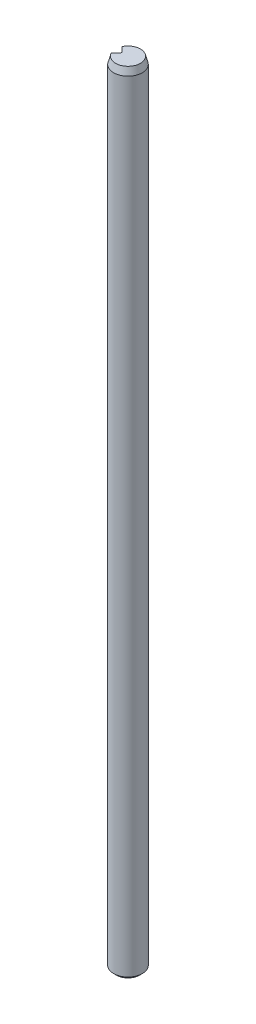
ISO-10303-21;
HEADER;
FILE_DESCRIPTION(('STEP AP214'),'2;1');
FILE_NAME('part.step','',(''),(''),'','','');
FILE_SCHEMA(('AUTOMOTIVE_DESIGN { 1 0 10303 214 1 1 1 1 }'));
ENDSEC;
DATA;
#1=APPLICATION_CONTEXT('core data for automotive mechanical design processes');
#2=APPLICATION_PROTOCOL_DEFINITION('international standard','automotive_design',2000,#1);
#3=PRODUCT_CONTEXT('',#1,'mechanical');
#4=PRODUCT('Part','Part','',(#3));
#5=PRODUCT_RELATED_PRODUCT_CATEGORY('part','',(#4));
#6=PRODUCT_DEFINITION_FORMATION('','',#4);
#7=PRODUCT_DEFINITION_CONTEXT('part definition',#1,'design');
#8=PRODUCT_DEFINITION('design','',#6,#7);
#9=PRODUCT_DEFINITION_SHAPE('','',#8);
#10=(LENGTH_UNIT() NAMED_UNIT(*) SI_UNIT(.MILLI.,.METRE.));
#11=(NAMED_UNIT(*) PLANE_ANGLE_UNIT() SI_UNIT($,.RADIAN.));
#12=(NAMED_UNIT(*) SI_UNIT($,.STERADIAN.) SOLID_ANGLE_UNIT());
#13=UNCERTAINTY_MEASURE_WITH_UNIT(LENGTH_MEASURE(1.E-05),#10,'distance_accuracy_value','');
#14=(GEOMETRIC_REPRESENTATION_CONTEXT(3) GLOBAL_UNCERTAINTY_ASSIGNED_CONTEXT((#13)) GLOBAL_UNIT_ASSIGNED_CONTEXT((#10,
#11,#12)) REPRESENTATION_CONTEXT('',''));
#15=CARTESIAN_POINT('',(0.,0.,0.));
#16=DIRECTION('',(0.,0.,1.));
#17=DIRECTION('',(1.,0.,0.));
#18=AXIS2_PLACEMENT_3D('',#15,#16,#17);
#19=CARTESIAN_POINT('',(0.,55.,0.));
#20=DIRECTION('',(0.,-1.,0.));
#21=DIRECTION('',(0.,0.,-1.));
#22=AXIS2_PLACEMENT_3D('',#19,#20,#21);
#23=CYLINDRICAL_SURFACE('',#22,1.);
#24=DIRECTION('',(0.,1.,0.));
#25=VECTOR('',#24,1.);
#26=CARTESIAN_POINT('',(-0.878280892974548,0.,0.478145033473976));
#27=LINE('',#26,#25);
#28=CARTESIAN_POINT('',(-0.878280892974548,0.199999999999992,0.478145033473976));
#29=VERTEX_POINT('',#28);
#30=CARTESIAN_POINT('',(-0.878280892974548,54.5,0.478145033473976));
#31=VERTEX_POINT('',#30);
#32=EDGE_CURVE('E122',#29,#31,#27,.T.);
#33=ORIENTED_EDGE('',*,*,#32,.F.);
#34=CARTESIAN_POINT('',(0.,0.199999999999992,0.));
#35=DIRECTION('',(0.,1.,0.));
#36=DIRECTION('',(0.,0.,1.));
#37=AXIS2_PLACEMENT_3D('',#34,#35,#36);
#38=CIRCLE('',#37,1.);
#39=CARTESIAN_POINT('',(-0.878280892974548,0.199999999999992,-0.478145033473976));
#40=VERTEX_POINT('',#39);
#41=EDGE_CURVE('E150',#29,#40,#38,.T.);
#42=ORIENTED_EDGE('',*,*,#41,.T.);
#43=DIRECTION('',(0.,1.,0.));
#44=VECTOR('',#43,1.);
#45=CARTESIAN_POINT('',(-0.878280892974548,0.,-0.478145033473976));
#46=LINE('',#45,#44);
#47=CARTESIAN_POINT('',(-0.878280892974548,54.5,-0.478145033473976));
#48=VERTEX_POINT('',#47);
#49=EDGE_CURVE('E108',#40,#48,#46,.T.);
#50=ORIENTED_EDGE('',*,*,#49,.T.);
#51=CARTESIAN_POINT('',(0.,54.5,0.));
#52=DIRECTION('',(0.,1.,0.));
#53=DIRECTION('',(0.,0.,1.));
#54=AXIS2_PLACEMENT_3D('',#51,#52,#53);
#55=CIRCLE('',#54,1.);
#56=EDGE_CURVE('E133',#48,#31,#55,.F.);
#57=ORIENTED_EDGE('',*,*,#56,.T.);
#58=EDGE_LOOP('',(#33,#42,#50,#57));
#59=FACE_BOUND('',#58,.T.);
#60=ADVANCED_FACE('F33',(#59),#23,.T.);
#61=CARTESIAN_POINT('',(0.,55.,0.));
#62=DIRECTION('',(0.,1.,0.));
#63=DIRECTION('',(0.,0.,1.));
#64=AXIS2_PLACEMENT_3D('',#61,#62,#63);
#65=PLANE('',#64);
#66=DIRECTION('',(0.707106781186548,0.,-0.707106781186547));
#67=VECTOR('',#66,1.);
#68=CARTESIAN_POINT('',(-0.400135859500572,55.,0.));
#69=LINE('',#68,#67);
#70=CARTESIAN_POINT('',(-0.778836297480789,55.,0.378700437980217));
#71=VERTEX_POINT('',#70);
#72=CARTESIAN_POINT('',(-0.470846537619226,55.,0.0707106781186547));
#73=VERTEX_POINT('',#72);
#74=EDGE_CURVE('E115',#71,#73,#69,.T.);
#75=ORIENTED_EDGE('',*,*,#74,.F.);
#76=CARTESIAN_POINT('',(0.,55.,0.));
#77=DIRECTION('',(0.,1.,0.));
#78=DIRECTION('',(0.,0.,1.));
#79=AXIS2_PLACEMENT_3D('',#76,#77,#78);
#80=CIRCLE('',#79,0.866025403784434);
#81=CARTESIAN_POINT('',(-0.778836297480789,55.,-0.378700437980217));
#82=VERTEX_POINT('',#81);
#83=EDGE_CURVE('E113',#71,#82,#80,.T.);
#84=ORIENTED_EDGE('',*,*,#83,.T.);
#85=DIRECTION('',(-0.707106781186548,0.,-0.707106781186547));
#86=VECTOR('',#85,1.);
#87=CARTESIAN_POINT('',(-0.878280892974548,55.,-0.478145033473976));
#88=LINE('',#87,#86);
#89=CARTESIAN_POINT('',(-0.470846537619226,55.,-0.0707106781186547));
#90=VERTEX_POINT('',#89);
#91=EDGE_CURVE('E106',#90,#82,#88,.T.);
#92=ORIENTED_EDGE('',*,*,#91,.F.);
#93=CARTESIAN_POINT('',(-0.541557215737881,55.,0.));
#94=DIRECTION('',(0.,1.,0.));
#95=DIRECTION('',(0.,0.,1.));
#96=AXIS2_PLACEMENT_3D('',#93,#94,#95);
#97=CIRCLE('',#96,0.1);
#98=EDGE_CURVE('E91',#90,#73,#97,.F.);
#99=ORIENTED_EDGE('',*,*,#98,.T.);
#100=EDGE_LOOP('',(#75,#84,#92,#99));
#101=FACE_BOUND('',#100,.T.);
#102=ADVANCED_FACE('F111',(#101),#65,.T.);
#103=CARTESIAN_POINT('',(0.,0.,0.));
#104=DIRECTION('',(0.,1.,0.));
#105=DIRECTION('',(0.,0.,1.));
#106=AXIS2_PLACEMENT_3D('',#103,#104,#105);
#107=PLANE('',#106);
#108=DIRECTION('',(-0.707106781186548,0.,-0.707106781186547));
#109=VECTOR('',#108,1.);
#110=CARTESIAN_POINT('',(-0.878280892974548,0.,-0.478145033473976));
#111=LINE('',#110,#109);
#112=CARTESIAN_POINT('',(-0.470846537619226,0.,-0.0707106781186547));
#113=VERTEX_POINT('',#112);
#114=CARTESIAN_POINT('',(-0.729192511947562,0.,-0.32905665244699));
#115=VERTEX_POINT('',#114);
#116=EDGE_CURVE('E107',#113,#115,#111,.T.);
#117=ORIENTED_EDGE('',*,*,#116,.T.);
#118=CARTESIAN_POINT('',(0.,0.,0.));
#119=DIRECTION('',(0.,1.,0.));
#120=DIRECTION('',(0.,0.,1.));
#121=AXIS2_PLACEMENT_3D('',#118,#119,#120);
#122=CIRCLE('',#121,0.800000000000009);
#123=CARTESIAN_POINT('',(-0.729192511947562,0.,0.32905665244699));
#124=VERTEX_POINT('',#123);
#125=EDGE_CURVE('E46',#115,#124,#122,.F.);
#126=ORIENTED_EDGE('',*,*,#125,.T.);
#127=DIRECTION('',(0.707106781186548,0.,-0.707106781186547));
#128=VECTOR('',#127,1.);
#129=CARTESIAN_POINT('',(-0.400135859500572,0.,0.));
#130=LINE('',#129,#128);
#131=CARTESIAN_POINT('',(-0.470846537619226,0.,0.0707106781186547));
#132=VERTEX_POINT('',#131);
#133=EDGE_CURVE('E114',#124,#132,#130,.T.);
#134=ORIENTED_EDGE('',*,*,#133,.T.);
#135=CARTESIAN_POINT('',(-0.541557215737881,0.,0.));
#136=DIRECTION('',(0.,1.,0.));
#137=DIRECTION('',(0.,0.,1.));
#138=AXIS2_PLACEMENT_3D('',#135,#136,#137);
#139=CIRCLE('',#138,0.1);
#140=EDGE_CURVE('E101',#132,#113,#139,.T.);
#141=ORIENTED_EDGE('',*,*,#140,.T.);
#142=EDGE_LOOP('',(#117,#126,#134,#141));
#143=FACE_BOUND('',#142,.T.);
#144=ADVANCED_FACE('F141',(#143),#107,.F.);
#145=CARTESIAN_POINT('',(-0.878280892974548,0.,-0.478145033473976));
#146=DIRECTION('',(0.707106781186547,0.,-0.707106781186548));
#147=DIRECTION('',(-0.707106781186548,0.,-0.707106781186547));
#148=AXIS2_PLACEMENT_3D('',#145,#146,#147);
#149=PLANE('',#148);
#150=ORIENTED_EDGE('',*,*,#49,.F.);
#151=CARTESIAN_POINT('',(-0.878280892974548,0.199999999999992,-0.478145033473976));
#152=CARTESIAN_POINT('',(-0.853560720112385,0.166476995824775,-0.453424860611813));
#153=CARTESIAN_POINT('',(-0.828794369266961,0.133021421270187,-0.428658509766389));
#154=CARTESIAN_POINT('',(-0.791535665449019,0.0830009543926953,-0.391399805948447));
#155=CARTESIAN_POINT('',(-0.779097907516318,0.0663546228998887,-0.378962048015746));
#156=CARTESIAN_POINT('',(-0.754179221522723,0.0331263818504096,-0.354043362022151));
#157=CARTESIAN_POINT('',(-0.741698293048183,0.0165444729142652,-0.341562433547611));
#158=CARTESIAN_POINT('',(-0.729192511947562,0.,-0.32905665244699));
#159=B_SPLINE_CURVE_WITH_KNOTS('',3,(#151,#152,#153,#154,#155,#156,#157,#158),.UNSPECIFIED.,.F.,
.F.,(4,2,2,4),(0.,0.145305985315924,0.217958905103016,0.290612522968146),.UNSPECIFIED.);
#160=EDGE_CURVE('E60',#40,#115,#159,.T.);
#161=ORIENTED_EDGE('',*,*,#160,.T.);
#162=ORIENTED_EDGE('',*,*,#116,.F.);
#163=DIRECTION('',(0.,1.,0.));
#164=VECTOR('',#163,1.);
#165=CARTESIAN_POINT('',(-0.470846537619227,55.,-0.0707106781186547));
#166=LINE('',#165,#164);
#167=EDGE_CURVE('E95',#113,#90,#166,.T.);
#168=ORIENTED_EDGE('',*,*,#167,.T.);
#169=ORIENTED_EDGE('',*,*,#91,.T.);
#170=CARTESIAN_POINT('',(-0.778836297480789,55.,-0.378700437980217));
#171=CARTESIAN_POINT('',(-0.795522766451599,54.9167113590415,-0.395386906951027));
#172=CARTESIAN_POINT('',(-0.812153051098877,54.8334003691738,-0.412017191598305));
#173=CARTESIAN_POINT('',(-0.845301249582123,54.6667337025012,-0.445165390081551));
#174=CARTESIAN_POINT('',(-0.861819163432766,54.5833780257023,-0.461683303932194));
#175=CARTESIAN_POINT('',(-0.878280892974549,54.5,-0.478145033473976));
#176=B_SPLINE_CURVE_WITH_KNOTS('',3,(#170,#171,#172,#173,#174,#175),.UNSPECIFIED.,.F.,.F.,(4,2,
4),(0.,0.259701143449214,0.519402252986724),.UNSPECIFIED.);
#177=EDGE_CURVE('E127',#82,#48,#176,.T.);
#178=ORIENTED_EDGE('',*,*,#177,.T.);
#179=EDGE_LOOP('',(#150,#161,#162,#168,#169,#178));
#180=FACE_BOUND('',#179,.T.);
#181=ADVANCED_FACE('F104',(#180),#149,.F.);
#182=CARTESIAN_POINT('',(-0.400135859500572,0.,0.));
#183=DIRECTION('',(0.707106781186547,0.,0.707106781186548));
#184=DIRECTION('',(0.707106781186548,0.,-0.707106781186547));
#185=AXIS2_PLACEMENT_3D('',#182,#183,#184);
#186=PLANE('',#185);
#187=ORIENTED_EDGE('',*,*,#133,.F.);
#188=CARTESIAN_POINT('',(-0.729192511947562,0.,0.32905665244699));
#189=CARTESIAN_POINT('',(-0.741698293048182,0.0165444729142653,0.341562433547611));
#190=CARTESIAN_POINT('',(-0.754179221522723,0.0331263818504096,0.354043362022152));
#191=CARTESIAN_POINT('',(-0.779097907516318,0.0663546228998887,0.378962048015746));
#192=CARTESIAN_POINT('',(-0.791535665449019,0.0830009543926953,0.391399805948447));
#193=CARTESIAN_POINT('',(-0.828794369266961,0.133021421270187,0.42865850976639));
#194=CARTESIAN_POINT('',(-0.853560720112385,0.166476995824775,0.453424860611813));
#195=CARTESIAN_POINT('',(-0.878280892974548,0.199999999999992,0.478145033473976));
#196=B_SPLINE_CURVE_WITH_KNOTS('',3,(#188,#189,#190,#191,#192,#193,#194,#195),.UNSPECIFIED.,.F.,
.F.,(4,2,2,4),(0.,0.0726536178651295,0.145306537652222,0.290612522968146),.UNSPECIFIED.);
#197=EDGE_CURVE('E11',#124,#29,#196,.T.);
#198=ORIENTED_EDGE('',*,*,#197,.T.);
#199=ORIENTED_EDGE('',*,*,#32,.T.);
#200=CARTESIAN_POINT('',(-0.878280892974548,54.5,0.478145033473976));
#201=CARTESIAN_POINT('',(-0.861819163432765,54.5833780257023,0.461683303932193));
#202=CARTESIAN_POINT('',(-0.845301249582122,54.6667337025012,0.445165390081551));
#203=CARTESIAN_POINT('',(-0.812153051098875,54.8334003691738,0.412017191598304));
#204=CARTESIAN_POINT('',(-0.795522766451598,54.9167113590415,0.395386906951026));
#205=CARTESIAN_POINT('',(-0.778836297480788,55.,0.378700437980216));
#206=B_SPLINE_CURVE_WITH_KNOTS('',3,(#200,#201,#202,#203,#204,#205),.UNSPECIFIED.,.F.,.F.,(4,2,
4),(0.,0.259701109537517,0.519402252986731),.UNSPECIFIED.);
#207=EDGE_CURVE('E152',#31,#71,#206,.T.);
#208=ORIENTED_EDGE('',*,*,#207,.T.);
#209=ORIENTED_EDGE('',*,*,#74,.T.);
#210=DIRECTION('',(0.,1.,0.));
#211=VECTOR('',#210,1.);
#212=CARTESIAN_POINT('',(-0.470846537619226,0.,0.0707106781186548));
#213=LINE('',#212,#211);
#214=EDGE_CURVE('E97',#73,#132,#213,.F.);
#215=ORIENTED_EDGE('',*,*,#214,.T.);
#216=EDGE_LOOP('',(#187,#198,#199,#208,#209,#215));
#217=FACE_BOUND('',#216,.T.);
#218=ADVANCED_FACE('F140',(#217),#186,.F.);
#219=CARTESIAN_POINT('',(-0.541557215737881,0.,0.));
#220=DIRECTION('',(0.,-1.,0.));
#221=DIRECTION('',(0.,0.,-1.));
#222=AXIS2_PLACEMENT_3D('',#219,#220,#221);
#223=CYLINDRICAL_SURFACE('',#222,0.1);
#224=ORIENTED_EDGE('',*,*,#140,.F.);
#225=ORIENTED_EDGE('',*,*,#214,.F.);
#226=ORIENTED_EDGE('',*,*,#98,.F.);
#227=ORIENTED_EDGE('',*,*,#167,.F.);
#228=EDGE_LOOP('',(#224,#225,#226,#227));
#229=FACE_BOUND('',#228,.T.);
#230=ADVANCED_FACE('F94',(#229),#223,.F.);
#231=CARTESIAN_POINT('',(0.,55.,0.));
#232=DIRECTION('',(0.,-1.,0.));
#233=DIRECTION('',(0.,0.,-1.));
#234=AXIS2_PLACEMENT_3D('',#231,#232,#233);
#235=CONICAL_SURFACE('',#234,0.866025403784434,0.261799387799143);
#236=ORIENTED_EDGE('',*,*,#207,.F.);
#237=ORIENTED_EDGE('',*,*,#56,.F.);
#238=ORIENTED_EDGE('',*,*,#177,.F.);
#239=ORIENTED_EDGE('',*,*,#83,.F.);
#240=EDGE_LOOP('',(#236,#237,#238,#239));
#241=FACE_BOUND('',#240,.T.);
#242=ADVANCED_FACE('F135',(#241),#235,.T.);
#243=CARTESIAN_POINT('',(0.,0.199999999999992,0.));
#244=DIRECTION('',(0.,1.,0.));
#245=DIRECTION('',(0.,0.,1.));
#246=AXIS2_PLACEMENT_3D('',#243,#244,#245);
#247=CONICAL_SURFACE('',#246,1.,0.785398163397446);
#248=ORIENTED_EDGE('',*,*,#197,.F.);
#249=ORIENTED_EDGE('',*,*,#125,.F.);
#250=ORIENTED_EDGE('',*,*,#160,.F.);
#251=ORIENTED_EDGE('',*,*,#41,.F.);
#252=EDGE_LOOP('',(#248,#249,#250,#251));
#253=FACE_BOUND('',#252,.T.);
#254=ADVANCED_FACE('F35',(#253),#247,.T.);
#255=CLOSED_SHELL('',(#60,#102,#144,#181,#218,#230,#242,#254));
#256=MANIFOLD_SOLID_BREP('B2',#255);
#257=ADVANCED_BREP_SHAPE_REPRESENTATION('',(#18,#256),#14);
#258=SHAPE_DEFINITION_REPRESENTATION(#9,#257);
ENDSEC;
END-ISO-10303-21;
